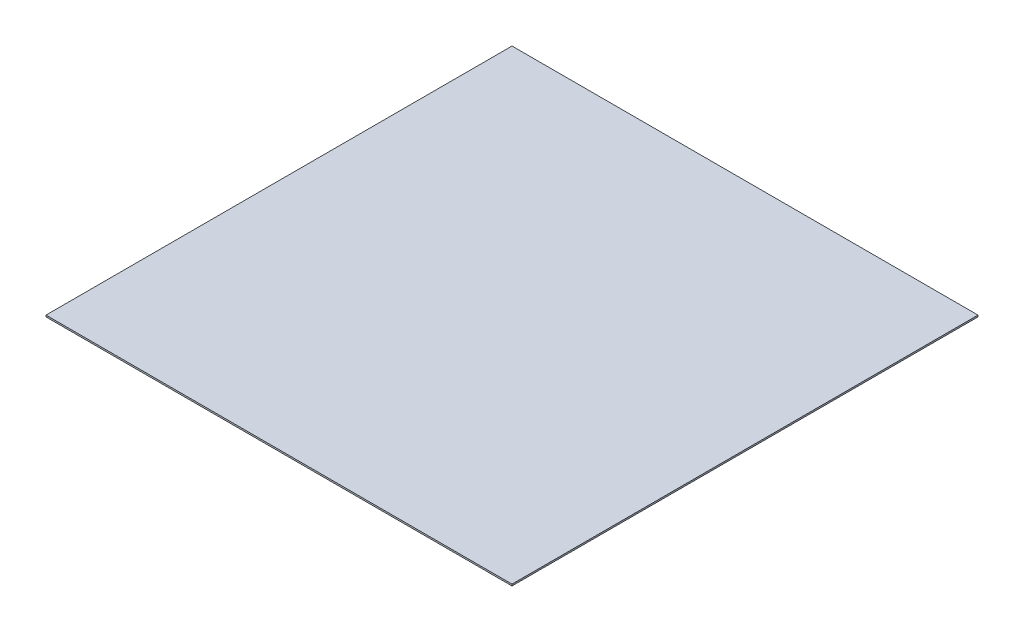
ISO-10303-21;
HEADER;
FILE_DESCRIPTION(('STEP AP214'),'2;1');
FILE_NAME('part.step','',(''),(''),'','','');
FILE_SCHEMA(('AUTOMOTIVE_DESIGN { 1 0 10303 214 1 1 1 1 }'));
ENDSEC;
DATA;
#1=APPLICATION_CONTEXT('core data for automotive mechanical design processes');
#2=APPLICATION_PROTOCOL_DEFINITION('international standard','automotive_design',2000,#1);
#3=PRODUCT_CONTEXT('',#1,'mechanical');
#4=PRODUCT('Part','Part','',(#3));
#5=PRODUCT_RELATED_PRODUCT_CATEGORY('part','',(#4));
#6=PRODUCT_DEFINITION_FORMATION('','',#4);
#7=PRODUCT_DEFINITION_CONTEXT('part definition',#1,'design');
#8=PRODUCT_DEFINITION('design','',#6,#7);
#9=PRODUCT_DEFINITION_SHAPE('','',#8);
#10=(LENGTH_UNIT() NAMED_UNIT(*) SI_UNIT(.MILLI.,.METRE.));
#11=(NAMED_UNIT(*) PLANE_ANGLE_UNIT() SI_UNIT($,.RADIAN.));
#12=(NAMED_UNIT(*) SI_UNIT($,.STERADIAN.) SOLID_ANGLE_UNIT());
#13=UNCERTAINTY_MEASURE_WITH_UNIT(LENGTH_MEASURE(1.E-05),#10,'distance_accuracy_value','');
#14=(GEOMETRIC_REPRESENTATION_CONTEXT(3) GLOBAL_UNCERTAINTY_ASSIGNED_CONTEXT((#13)) GLOBAL_UNIT_ASSIGNED_CONTEXT((#10,
#11,#12)) REPRESENTATION_CONTEXT('',''));
#15=CARTESIAN_POINT('',(0.,0.,0.));
#16=DIRECTION('',(0.,0.,1.));
#17=DIRECTION('',(1.,0.,0.));
#18=AXIS2_PLACEMENT_3D('',#15,#16,#17);
#19=CARTESIAN_POINT('',(457.2,3.175,457.2));
#20=DIRECTION('',(-1.,0.,0.));
#21=DIRECTION('',(0.,0.,1.));
#22=AXIS2_PLACEMENT_3D('',#19,#20,#21);
#23=PLANE('',#22);
#24=DIRECTION('',(0.,0.,-1.));
#25=VECTOR('',#24,1.);
#26=CARTESIAN_POINT('',(457.2,0.,457.2));
#27=LINE('',#26,#25);
#28=CARTESIAN_POINT('',(457.2,0.,457.2));
#29=VERTEX_POINT('',#28);
#30=CARTESIAN_POINT('',(457.2,0.,-457.2));
#31=VERTEX_POINT('',#30);
#32=EDGE_CURVE('E100',#29,#31,#27,.T.);
#33=ORIENTED_EDGE('',*,*,#32,.T.);
#34=DIRECTION('',(0.,-1.,0.));
#35=VECTOR('',#34,1.);
#36=CARTESIAN_POINT('',(457.2,3.175,-457.2));
#37=LINE('',#36,#35);
#38=CARTESIAN_POINT('',(457.2,3.175,-457.2));
#39=VERTEX_POINT('',#38);
#40=EDGE_CURVE('E11',#39,#31,#37,.T.);
#41=ORIENTED_EDGE('',*,*,#40,.F.);
#42=DIRECTION('',(0.,0.,-1.));
#43=VECTOR('',#42,1.);
#44=CARTESIAN_POINT('',(457.2,3.175,457.2));
#45=LINE('',#44,#43);
#46=CARTESIAN_POINT('',(457.2,3.175,457.2));
#47=VERTEX_POINT('',#46);
#48=EDGE_CURVE('E88',#47,#39,#45,.T.);
#49=ORIENTED_EDGE('',*,*,#48,.F.);
#50=DIRECTION('',(0.,-1.,0.));
#51=VECTOR('',#50,1.);
#52=CARTESIAN_POINT('',(457.2,3.175,457.2));
#53=LINE('',#52,#51);
#54=EDGE_CURVE('E96',#47,#29,#53,.T.);
#55=ORIENTED_EDGE('',*,*,#54,.T.);
#56=EDGE_LOOP('',(#33,#41,#49,#55));
#57=FACE_BOUND('',#56,.T.);
#58=ADVANCED_FACE('F37',(#57),#23,.F.);
#59=CARTESIAN_POINT('',(-457.2,3.175,-457.2));
#60=DIRECTION('',(0.,0.,1.));
#61=DIRECTION('',(1.,0.,0.));
#62=AXIS2_PLACEMENT_3D('',#59,#60,#61);
#63=PLANE('',#62);
#64=DIRECTION('',(-1.,0.,0.));
#65=VECTOR('',#64,1.);
#66=CARTESIAN_POINT('',(-457.2,0.,-457.2));
#67=LINE('',#66,#65);
#68=CARTESIAN_POINT('',(-457.2,0.,-457.2));
#69=VERTEX_POINT('',#68);
#70=EDGE_CURVE('E92',#31,#69,#67,.T.);
#71=ORIENTED_EDGE('',*,*,#70,.T.);
#72=DIRECTION('',(0.,-1.,0.));
#73=VECTOR('',#72,1.);
#74=CARTESIAN_POINT('',(-457.2,3.175,-457.2));
#75=LINE('',#74,#73);
#76=CARTESIAN_POINT('',(-457.2,3.175,-457.2));
#77=VERTEX_POINT('',#76);
#78=EDGE_CURVE('E45',#77,#69,#75,.T.);
#79=ORIENTED_EDGE('',*,*,#78,.F.);
#80=DIRECTION('',(-1.,0.,0.));
#81=VECTOR('',#80,1.);
#82=CARTESIAN_POINT('',(-457.2,3.175,-457.2));
#83=LINE('',#82,#81);
#84=EDGE_CURVE('E83',#39,#77,#83,.T.);
#85=ORIENTED_EDGE('',*,*,#84,.F.);
#86=ORIENTED_EDGE('',*,*,#40,.T.);
#87=EDGE_LOOP('',(#71,#79,#85,#86));
#88=FACE_BOUND('',#87,.T.);
#89=ADVANCED_FACE('F91',(#88),#63,.F.);
#90=CARTESIAN_POINT('',(-457.2,3.175,457.2));
#91=DIRECTION('',(1.,0.,0.));
#92=DIRECTION('',(0.,0.,-1.));
#93=AXIS2_PLACEMENT_3D('',#90,#91,#92);
#94=PLANE('',#93);
#95=DIRECTION('',(0.,0.,1.));
#96=VECTOR('',#95,1.);
#97=CARTESIAN_POINT('',(-457.2,0.,457.2));
#98=LINE('',#97,#96);
#99=CARTESIAN_POINT('',(-457.2,0.,457.2));
#100=VERTEX_POINT('',#99);
#101=EDGE_CURVE('E70',#69,#100,#98,.T.);
#102=ORIENTED_EDGE('',*,*,#101,.T.);
#103=DIRECTION('',(0.,-1.,0.));
#104=VECTOR('',#103,1.);
#105=CARTESIAN_POINT('',(-457.2,3.175,457.2));
#106=LINE('',#105,#104);
#107=CARTESIAN_POINT('',(-457.2,3.175,457.2));
#108=VERTEX_POINT('',#107);
#109=EDGE_CURVE('E93',#108,#100,#106,.T.);
#110=ORIENTED_EDGE('',*,*,#109,.F.);
#111=DIRECTION('',(0.,0.,1.));
#112=VECTOR('',#111,1.);
#113=CARTESIAN_POINT('',(-457.2,3.175,457.2));
#114=LINE('',#113,#112);
#115=EDGE_CURVE('E86',#77,#108,#114,.T.);
#116=ORIENTED_EDGE('',*,*,#115,.F.);
#117=ORIENTED_EDGE('',*,*,#78,.T.);
#118=EDGE_LOOP('',(#102,#110,#116,#117));
#119=FACE_BOUND('',#118,.T.);
#120=ADVANCED_FACE('F94',(#119),#94,.F.);
#121=CARTESIAN_POINT('',(-457.2,3.175,457.2));
#122=DIRECTION('',(0.,0.,-1.));
#123=DIRECTION('',(-1.,0.,0.));
#124=AXIS2_PLACEMENT_3D('',#121,#122,#123);
#125=PLANE('',#124);
#126=DIRECTION('',(1.,0.,0.));
#127=VECTOR('',#126,1.);
#128=CARTESIAN_POINT('',(-457.2,0.,457.2));
#129=LINE('',#128,#127);
#130=EDGE_CURVE('E76',#100,#29,#129,.T.);
#131=ORIENTED_EDGE('',*,*,#130,.T.);
#132=ORIENTED_EDGE('',*,*,#54,.F.);
#133=DIRECTION('',(1.,0.,0.));
#134=VECTOR('',#133,1.);
#135=CARTESIAN_POINT('',(-457.2,3.175,457.2));
#136=LINE('',#135,#134);
#137=EDGE_CURVE('E53',#108,#47,#136,.T.);
#138=ORIENTED_EDGE('',*,*,#137,.F.);
#139=ORIENTED_EDGE('',*,*,#109,.T.);
#140=EDGE_LOOP('',(#131,#132,#138,#139));
#141=FACE_BOUND('',#140,.T.);
#142=ADVANCED_FACE('F107',(#141),#125,.F.);
#143=CARTESIAN_POINT('',(0.,3.175,0.));
#144=DIRECTION('',(0.,-1.,0.));
#145=DIRECTION('',(0.,0.,-1.));
#146=AXIS2_PLACEMENT_3D('',#143,#144,#145);
#147=PLANE('',#146);
#148=ORIENTED_EDGE('',*,*,#48,.T.);
#149=ORIENTED_EDGE('',*,*,#84,.T.);
#150=ORIENTED_EDGE('',*,*,#115,.T.);
#151=ORIENTED_EDGE('',*,*,#137,.T.);
#152=EDGE_LOOP('',(#148,#149,#150,#151));
#153=FACE_BOUND('',#152,.T.);
#154=ADVANCED_FACE('F84',(#153),#147,.F.);
#155=CARTESIAN_POINT('',(0.,0.,0.));
#156=DIRECTION('',(0.,-1.,0.));
#157=DIRECTION('',(0.,0.,-1.));
#158=AXIS2_PLACEMENT_3D('',#155,#156,#157);
#159=PLANE('',#158);
#160=ORIENTED_EDGE('',*,*,#32,.F.);
#161=ORIENTED_EDGE('',*,*,#130,.F.);
#162=ORIENTED_EDGE('',*,*,#101,.F.);
#163=ORIENTED_EDGE('',*,*,#70,.F.);
#164=EDGE_LOOP('',(#160,#161,#162,#163));
#165=FACE_BOUND('',#164,.T.);
#166=ADVANCED_FACE('F110',(#165),#159,.T.);
#167=CLOSED_SHELL('',(#58,#89,#120,#142,#154,#166));
#168=MANIFOLD_SOLID_BREP('B2',#167);
#169=ADVANCED_BREP_SHAPE_REPRESENTATION('',(#18,#168),#14);
#170=SHAPE_DEFINITION_REPRESENTATION(#9,#169);
ENDSEC;
END-ISO-10303-21;
